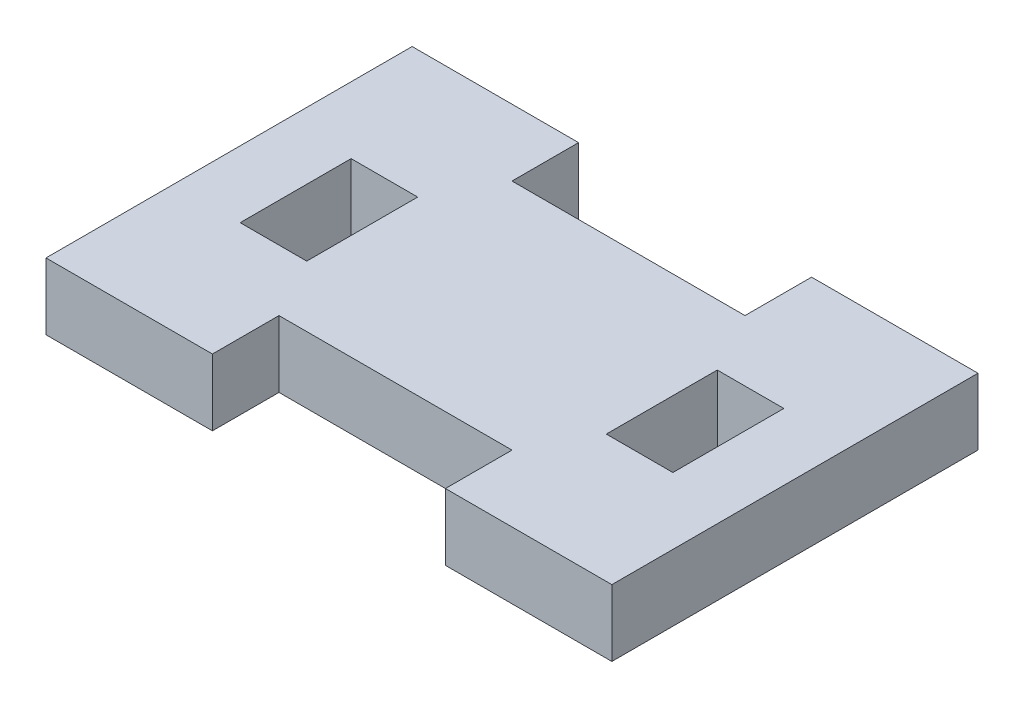
ISO-10303-21;
HEADER;
FILE_DESCRIPTION(('STEP AP214'),'2;1');
FILE_NAME('part.step','',(''),(''),'','','');
FILE_SCHEMA(('AUTOMOTIVE_DESIGN { 1 0 10303 214 1 1 1 1 }'));
ENDSEC;
DATA;
#1=APPLICATION_CONTEXT('core data for automotive mechanical design processes');
#2=APPLICATION_PROTOCOL_DEFINITION('international standard','automotive_design',2000,#1);
#3=PRODUCT_CONTEXT('',#1,'mechanical');
#4=PRODUCT('Part','Part','',(#3));
#5=PRODUCT_RELATED_PRODUCT_CATEGORY('part','',(#4));
#6=PRODUCT_DEFINITION_FORMATION('','',#4);
#7=PRODUCT_DEFINITION_CONTEXT('part definition',#1,'design');
#8=PRODUCT_DEFINITION('design','',#6,#7);
#9=PRODUCT_DEFINITION_SHAPE('','',#8);
#10=(LENGTH_UNIT() NAMED_UNIT(*) SI_UNIT(.MILLI.,.METRE.));
#11=(NAMED_UNIT(*) PLANE_ANGLE_UNIT() SI_UNIT($,.RADIAN.));
#12=(NAMED_UNIT(*) SI_UNIT($,.STERADIAN.) SOLID_ANGLE_UNIT());
#13=UNCERTAINTY_MEASURE_WITH_UNIT(LENGTH_MEASURE(1.E-05),#10,'distance_accuracy_value','');
#14=(GEOMETRIC_REPRESENTATION_CONTEXT(3) GLOBAL_UNCERTAINTY_ASSIGNED_CONTEXT((#13)) GLOBAL_UNIT_ASSIGNED_CONTEXT((#10,
#11,#12)) REPRESENTATION_CONTEXT('',''));
#15=CARTESIAN_POINT('',(0.,0.,0.));
#16=DIRECTION('',(0.,0.,1.));
#17=DIRECTION('',(1.,0.,0.));
#18=AXIS2_PLACEMENT_3D('',#15,#16,#17);
#19=CARTESIAN_POINT('',(0.,3.,5.75));
#20=DIRECTION('',(0.,0.,1.));
#21=DIRECTION('',(1.,0.,0.));
#22=AXIS2_PLACEMENT_3D('',#19,#20,#21);
#23=PLANE('',#22);
#24=DIRECTION('',(-1.,0.,0.));
#25=VECTOR('',#24,1.);
#26=CARTESIAN_POINT('',(0.,0.,5.75));
#27=LINE('',#26,#25);
#28=CARTESIAN_POINT('',(6.,0.,5.75));
#29=VERTEX_POINT('',#28);
#30=CARTESIAN_POINT('',(3.,0.,5.75));
#31=VERTEX_POINT('',#30);
#32=EDGE_CURVE('E342',#29,#31,#27,.T.);
#33=ORIENTED_EDGE('',*,*,#32,.F.);
#34=DIRECTION('',(0.,-1.,0.));
#35=VECTOR('',#34,1.);
#36=CARTESIAN_POINT('',(6.,3.,5.75));
#37=LINE('',#36,#35);
#38=CARTESIAN_POINT('',(6.,3.,5.75));
#39=VERTEX_POINT('',#38);
#40=EDGE_CURVE('E11',#39,#29,#37,.T.);
#41=ORIENTED_EDGE('',*,*,#40,.F.);
#42=DIRECTION('',(-1.,0.,0.));
#43=VECTOR('',#42,1.);
#44=CARTESIAN_POINT('',(0.,3.,5.75));
#45=LINE('',#44,#43);
#46=CARTESIAN_POINT('',(3.,3.,5.75));
#47=VERTEX_POINT('',#46);
#48=EDGE_CURVE('E204',#39,#47,#45,.T.);
#49=ORIENTED_EDGE('',*,*,#48,.T.);
#50=DIRECTION('',(0.,-1.,0.));
#51=VECTOR('',#50,1.);
#52=CARTESIAN_POINT('',(3.,3.,5.75));
#53=LINE('',#52,#51);
#54=EDGE_CURVE('E65',#47,#31,#53,.T.);
#55=ORIENTED_EDGE('',*,*,#54,.T.);
#56=EDGE_LOOP('',(#33,#41,#49,#55));
#57=FACE_BOUND('',#56,.T.);
#58=ADVANCED_FACE('F45',(#57),#23,.T.);
#59=CARTESIAN_POINT('',(6.,3.,0.));
#60=DIRECTION('',(1.,0.,0.));
#61=DIRECTION('',(0.,0.,-1.));
#62=AXIS2_PLACEMENT_3D('',#59,#60,#61);
#63=PLANE('',#62);
#64=DIRECTION('',(0.,0.,1.));
#65=VECTOR('',#64,1.);
#66=CARTESIAN_POINT('',(6.,0.,0.));
#67=LINE('',#66,#65);
#68=CARTESIAN_POINT('',(6.,0.,10.75));
#69=VERTEX_POINT('',#68);
#70=EDGE_CURVE('E210',#29,#69,#67,.T.);
#71=ORIENTED_EDGE('',*,*,#70,.T.);
#72=DIRECTION('',(0.,-1.,0.));
#73=VECTOR('',#72,1.);
#74=CARTESIAN_POINT('',(6.,3.,10.75));
#75=LINE('',#74,#73);
#76=CARTESIAN_POINT('',(6.,3.,10.75));
#77=VERTEX_POINT('',#76);
#78=EDGE_CURVE('E56',#77,#69,#75,.T.);
#79=ORIENTED_EDGE('',*,*,#78,.F.);
#80=DIRECTION('',(0.,0.,1.));
#81=VECTOR('',#80,1.);
#82=CARTESIAN_POINT('',(6.,3.,0.));
#83=LINE('',#82,#81);
#84=EDGE_CURVE('E199',#39,#77,#83,.T.);
#85=ORIENTED_EDGE('',*,*,#84,.F.);
#86=ORIENTED_EDGE('',*,*,#40,.T.);
#87=EDGE_LOOP('',(#71,#79,#85,#86));
#88=FACE_BOUND('',#87,.T.);
#89=ADVANCED_FACE('F208',(#88),#63,.F.);
#90=CARTESIAN_POINT('',(0.,3.,10.75));
#91=DIRECTION('',(0.,0.,1.));
#92=DIRECTION('',(1.,0.,0.));
#93=AXIS2_PLACEMENT_3D('',#90,#91,#92);
#94=PLANE('',#93);
#95=DIRECTION('',(-1.,0.,0.));
#96=VECTOR('',#95,1.);
#97=CARTESIAN_POINT('',(0.,0.,10.75));
#98=LINE('',#97,#96);
#99=CARTESIAN_POINT('',(3.,0.,10.75));
#100=VERTEX_POINT('',#99);
#101=EDGE_CURVE('E347',#69,#100,#98,.T.);
#102=ORIENTED_EDGE('',*,*,#101,.T.);
#103=DIRECTION('',(0.,-1.,0.));
#104=VECTOR('',#103,1.);
#105=CARTESIAN_POINT('',(3.,3.,10.75));
#106=LINE('',#105,#104);
#107=CARTESIAN_POINT('',(3.,3.,10.75));
#108=VERTEX_POINT('',#107);
#109=EDGE_CURVE('E127',#108,#100,#106,.T.);
#110=ORIENTED_EDGE('',*,*,#109,.F.);
#111=DIRECTION('',(-1.,0.,0.));
#112=VECTOR('',#111,1.);
#113=CARTESIAN_POINT('',(0.,3.,10.75));
#114=LINE('',#113,#112);
#115=EDGE_CURVE('E190',#77,#108,#114,.T.);
#116=ORIENTED_EDGE('',*,*,#115,.F.);
#117=ORIENTED_EDGE('',*,*,#78,.T.);
#118=EDGE_LOOP('',(#102,#110,#116,#117));
#119=FACE_BOUND('',#118,.T.);
#120=ADVANCED_FACE('F192',(#119),#94,.F.);
#121=CARTESIAN_POINT('',(19.5,3.,0.));
#122=DIRECTION('',(1.,0.,0.));
#123=DIRECTION('',(0.,0.,-1.));
#124=AXIS2_PLACEMENT_3D('',#121,#122,#123);
#125=PLANE('',#124);
#126=DIRECTION('',(0.,0.,1.));
#127=VECTOR('',#126,1.);
#128=CARTESIAN_POINT('',(19.5,0.,0.));
#129=LINE('',#128,#127);
#130=CARTESIAN_POINT('',(19.5,0.,5.75));
#131=VERTEX_POINT('',#130);
#132=CARTESIAN_POINT('',(19.5,0.,10.75));
#133=VERTEX_POINT('',#132);
#134=EDGE_CURVE('E326',#131,#133,#129,.T.);
#135=ORIENTED_EDGE('',*,*,#134,.F.);
#136=DIRECTION('',(0.,-1.,0.));
#137=VECTOR('',#136,1.);
#138=CARTESIAN_POINT('',(19.5,3.,5.75));
#139=LINE('',#138,#137);
#140=CARTESIAN_POINT('',(19.5,3.,5.75));
#141=VERTEX_POINT('',#140);
#142=EDGE_CURVE('E227',#141,#131,#139,.T.);
#143=ORIENTED_EDGE('',*,*,#142,.F.);
#144=DIRECTION('',(0.,0.,1.));
#145=VECTOR('',#144,1.);
#146=CARTESIAN_POINT('',(19.5,3.,0.));
#147=LINE('',#146,#145);
#148=CARTESIAN_POINT('',(19.5,3.,10.75));
#149=VERTEX_POINT('',#148);
#150=EDGE_CURVE('E395',#141,#149,#147,.T.);
#151=ORIENTED_EDGE('',*,*,#150,.T.);
#152=DIRECTION('',(0.,-1.,0.));
#153=VECTOR('',#152,1.);
#154=CARTESIAN_POINT('',(19.5,3.,10.75));
#155=LINE('',#154,#153);
#156=EDGE_CURVE('E217',#149,#133,#155,.T.);
#157=ORIENTED_EDGE('',*,*,#156,.T.);
#158=EDGE_LOOP('',(#135,#143,#151,#157));
#159=FACE_BOUND('',#158,.T.);
#160=ADVANCED_FACE('F445',(#159),#125,.T.);
#161=CARTESIAN_POINT('',(0.,3.,5.75000000000001));
#162=DIRECTION('',(0.,0.,-1.));
#163=DIRECTION('',(-1.,0.,0.));
#164=AXIS2_PLACEMENT_3D('',#161,#162,#163);
#165=PLANE('',#164);
#166=DIRECTION('',(1.,0.,0.));
#167=VECTOR('',#166,1.);
#168=CARTESIAN_POINT('',(0.,0.,5.75000000000001));
#169=LINE('',#168,#167);
#170=CARTESIAN_POINT('',(22.5,0.,5.75));
#171=VERTEX_POINT('',#170);
#172=EDGE_CURVE('E330',#131,#171,#169,.T.);
#173=ORIENTED_EDGE('',*,*,#172,.T.);
#174=DIRECTION('',(0.,-1.,0.));
#175=VECTOR('',#174,1.);
#176=CARTESIAN_POINT('',(22.5,3.,5.75));
#177=LINE('',#176,#175);
#178=CARTESIAN_POINT('',(22.5,3.,5.75));
#179=VERTEX_POINT('',#178);
#180=EDGE_CURVE('E223',#179,#171,#177,.T.);
#181=ORIENTED_EDGE('',*,*,#180,.F.);
#182=DIRECTION('',(1.,0.,0.));
#183=VECTOR('',#182,1.);
#184=CARTESIAN_POINT('',(0.,3.,5.75000000000001));
#185=LINE('',#184,#183);
#186=EDGE_CURVE('E399',#141,#179,#185,.T.);
#187=ORIENTED_EDGE('',*,*,#186,.F.);
#188=ORIENTED_EDGE('',*,*,#142,.T.);
#189=EDGE_LOOP('',(#173,#181,#187,#188));
#190=FACE_BOUND('',#189,.T.);
#191=ADVANCED_FACE('F441',(#190),#165,.F.);
#192=CARTESIAN_POINT('',(22.5,3.,0.));
#193=DIRECTION('',(1.,0.,0.));
#194=DIRECTION('',(0.,0.,-1.));
#195=AXIS2_PLACEMENT_3D('',#192,#193,#194);
#196=PLANE('',#195);
#197=DIRECTION('',(0.,0.,1.));
#198=VECTOR('',#197,1.);
#199=CARTESIAN_POINT('',(22.5,0.,0.));
#200=LINE('',#199,#198);
#201=CARTESIAN_POINT('',(22.5,0.,10.75));
#202=VERTEX_POINT('',#201);
#203=EDGE_CURVE('E334',#171,#202,#200,.T.);
#204=ORIENTED_EDGE('',*,*,#203,.T.);
#205=DIRECTION('',(0.,-1.,0.));
#206=VECTOR('',#205,1.);
#207=CARTESIAN_POINT('',(22.5,3.,10.75));
#208=LINE('',#207,#206);
#209=CARTESIAN_POINT('',(22.5,3.,10.75));
#210=VERTEX_POINT('',#209);
#211=EDGE_CURVE('E220',#210,#202,#208,.T.);
#212=ORIENTED_EDGE('',*,*,#211,.F.);
#213=DIRECTION('',(0.,0.,1.));
#214=VECTOR('',#213,1.);
#215=CARTESIAN_POINT('',(22.5,3.,0.));
#216=LINE('',#215,#214);
#217=EDGE_CURVE('E403',#179,#210,#216,.T.);
#218=ORIENTED_EDGE('',*,*,#217,.F.);
#219=ORIENTED_EDGE('',*,*,#180,.T.);
#220=EDGE_LOOP('',(#204,#212,#218,#219));
#221=FACE_BOUND('',#220,.T.);
#222=ADVANCED_FACE('F438',(#221),#196,.F.);
#223=CARTESIAN_POINT('',(25.5,3.,0.));
#224=DIRECTION('',(1.,0.,0.));
#225=DIRECTION('',(0.,0.,-1.));
#226=AXIS2_PLACEMENT_3D('',#223,#224,#225);
#227=PLANE('',#226);
#228=DIRECTION('',(0.,0.,1.));
#229=VECTOR('',#228,1.);
#230=CARTESIAN_POINT('',(25.5,0.,0.));
#231=LINE('',#230,#229);
#232=CARTESIAN_POINT('',(25.5,0.,0.));
#233=VERTEX_POINT('',#232);
#234=CARTESIAN_POINT('',(25.5,0.,16.5));
#235=VERTEX_POINT('',#234);
#236=EDGE_CURVE('E278',#233,#235,#231,.T.);
#237=ORIENTED_EDGE('',*,*,#236,.F.);
#238=DIRECTION('',(0.,-1.,0.));
#239=VECTOR('',#238,1.);
#240=CARTESIAN_POINT('',(25.5,3.,0.));
#241=LINE('',#240,#239);
#242=CARTESIAN_POINT('',(25.5,3.,0.));
#243=VERTEX_POINT('',#242);
#244=EDGE_CURVE('E49',#243,#233,#241,.T.);
#245=ORIENTED_EDGE('',*,*,#244,.F.);
#246=DIRECTION('',(0.,0.,1.));
#247=VECTOR('',#246,1.);
#248=CARTESIAN_POINT('',(25.5,3.,0.));
#249=LINE('',#248,#247);
#250=CARTESIAN_POINT('',(25.5,3.,16.5));
#251=VERTEX_POINT('',#250);
#252=EDGE_CURVE('E353',#243,#251,#249,.T.);
#253=ORIENTED_EDGE('',*,*,#252,.T.);
#254=DIRECTION('',(0.,-1.,0.));
#255=VECTOR('',#254,1.);
#256=CARTESIAN_POINT('',(25.5,3.,16.5));
#257=LINE('',#256,#255);
#258=EDGE_CURVE('E230',#251,#235,#257,.T.);
#259=ORIENTED_EDGE('',*,*,#258,.T.);
#260=EDGE_LOOP('',(#237,#245,#253,#259));
#261=FACE_BOUND('',#260,.T.);
#262=ADVANCED_FACE('F47',(#261),#227,.T.);
#263=CARTESIAN_POINT('',(0.,3.,0.));
#264=DIRECTION('',(0.,0.,-1.));
#265=DIRECTION('',(-1.,0.,0.));
#266=AXIS2_PLACEMENT_3D('',#263,#264,#265);
#267=PLANE('',#266);
#268=DIRECTION('',(1.,0.,0.));
#269=VECTOR('',#268,1.);
#270=CARTESIAN_POINT('',(0.,0.,0.));
#271=LINE('',#270,#269);
#272=CARTESIAN_POINT('',(18.,0.,0.));
#273=VERTEX_POINT('',#272);
#274=EDGE_CURVE('E274',#273,#233,#271,.T.);
#275=ORIENTED_EDGE('',*,*,#274,.F.);
#276=DIRECTION('',(0.,-1.,0.));
#277=VECTOR('',#276,1.);
#278=CARTESIAN_POINT('',(18.,3.,0.));
#279=LINE('',#278,#277);
#280=CARTESIAN_POINT('',(18.,3.,0.));
#281=VERTEX_POINT('',#280);
#282=EDGE_CURVE('E262',#281,#273,#279,.T.);
#283=ORIENTED_EDGE('',*,*,#282,.F.);
#284=DIRECTION('',(1.,0.,0.));
#285=VECTOR('',#284,1.);
#286=CARTESIAN_POINT('',(0.,3.,0.));
#287=LINE('',#286,#285);
#288=EDGE_CURVE('E276',#281,#243,#287,.T.);
#289=ORIENTED_EDGE('',*,*,#288,.T.);
#290=ORIENTED_EDGE('',*,*,#244,.T.);
#291=EDGE_LOOP('',(#275,#283,#289,#290));
#292=FACE_BOUND('',#291,.T.);
#293=ADVANCED_FACE('F272',(#292),#267,.T.);
#294=CARTESIAN_POINT('',(18.,3.,0.));
#295=DIRECTION('',(1.,0.,0.));
#296=DIRECTION('',(0.,0.,-1.));
#297=AXIS2_PLACEMENT_3D('',#294,#295,#296);
#298=PLANE('',#297);
#299=DIRECTION('',(0.,0.,1.));
#300=VECTOR('',#299,1.);
#301=CARTESIAN_POINT('',(18.,0.,0.));
#302=LINE('',#301,#300);
#303=CARTESIAN_POINT('',(18.,0.,3.));
#304=VERTEX_POINT('',#303);
#305=EDGE_CURVE('E288',#273,#304,#302,.T.);
#306=ORIENTED_EDGE('',*,*,#305,.T.);
#307=DIRECTION('',(0.,-1.,0.));
#308=VECTOR('',#307,1.);
#309=CARTESIAN_POINT('',(18.,3.,3.));
#310=LINE('',#309,#308);
#311=CARTESIAN_POINT('',(18.,3.,3.));
#312=VERTEX_POINT('',#311);
#313=EDGE_CURVE('E260',#312,#304,#310,.T.);
#314=ORIENTED_EDGE('',*,*,#313,.F.);
#315=DIRECTION('',(0.,0.,1.));
#316=VECTOR('',#315,1.);
#317=CARTESIAN_POINT('',(18.,3.,0.));
#318=LINE('',#317,#316);
#319=EDGE_CURVE('E359',#281,#312,#318,.T.);
#320=ORIENTED_EDGE('',*,*,#319,.F.);
#321=ORIENTED_EDGE('',*,*,#282,.T.);
#322=EDGE_LOOP('',(#306,#314,#320,#321));
#323=FACE_BOUND('',#322,.T.);
#324=ADVANCED_FACE('F480',(#323),#298,.F.);
#325=CARTESIAN_POINT('',(0.,3.,3.));
#326=DIRECTION('',(0.,0.,-1.));
#327=DIRECTION('',(-1.,0.,0.));
#328=AXIS2_PLACEMENT_3D('',#325,#326,#327);
#329=PLANE('',#328);
#330=DIRECTION('',(1.,0.,0.));
#331=VECTOR('',#330,1.);
#332=CARTESIAN_POINT('',(0.,0.,3.));
#333=LINE('',#332,#331);
#334=CARTESIAN_POINT('',(7.5,0.,3.));
#335=VERTEX_POINT('',#334);
#336=EDGE_CURVE('E292',#335,#304,#333,.T.);
#337=ORIENTED_EDGE('',*,*,#336,.F.);
#338=DIRECTION('',(0.,-1.,0.));
#339=VECTOR('',#338,1.);
#340=CARTESIAN_POINT('',(7.5,3.,3.));
#341=LINE('',#340,#339);
#342=CARTESIAN_POINT('',(7.5,3.,3.));
#343=VERTEX_POINT('',#342);
#344=EDGE_CURVE('E257',#343,#335,#341,.T.);
#345=ORIENTED_EDGE('',*,*,#344,.F.);
#346=DIRECTION('',(1.,0.,0.));
#347=VECTOR('',#346,1.);
#348=CARTESIAN_POINT('',(0.,3.,3.));
#349=LINE('',#348,#347);
#350=EDGE_CURVE('E364',#343,#312,#349,.T.);
#351=ORIENTED_EDGE('',*,*,#350,.T.);
#352=ORIENTED_EDGE('',*,*,#313,.T.);
#353=EDGE_LOOP('',(#337,#345,#351,#352));
#354=FACE_BOUND('',#353,.T.);
#355=ADVANCED_FACE('F476',(#354),#329,.T.);
#356=CARTESIAN_POINT('',(7.5,3.,0.));
#357=DIRECTION('',(1.,0.,0.));
#358=DIRECTION('',(0.,0.,-1.));
#359=AXIS2_PLACEMENT_3D('',#356,#357,#358);
#360=PLANE('',#359);
#361=DIRECTION('',(0.,0.,1.));
#362=VECTOR('',#361,1.);
#363=CARTESIAN_POINT('',(7.5,0.,0.));
#364=LINE('',#363,#362);
#365=CARTESIAN_POINT('',(7.5,0.,0.));
#366=VERTEX_POINT('',#365);
#367=EDGE_CURVE('E298',#366,#335,#364,.T.);
#368=ORIENTED_EDGE('',*,*,#367,.F.);
#369=DIRECTION('',(0.,-1.,0.));
#370=VECTOR('',#369,1.);
#371=CARTESIAN_POINT('',(7.5,3.,0.));
#372=LINE('',#371,#370);
#373=CARTESIAN_POINT('',(7.5,3.,0.));
#374=VERTEX_POINT('',#373);
#375=EDGE_CURVE('E254',#374,#366,#372,.T.);
#376=ORIENTED_EDGE('',*,*,#375,.F.);
#377=DIRECTION('',(0.,0.,1.));
#378=VECTOR('',#377,1.);
#379=CARTESIAN_POINT('',(7.5,3.,0.));
#380=LINE('',#379,#378);
#381=EDGE_CURVE('E368',#374,#343,#380,.T.);
#382=ORIENTED_EDGE('',*,*,#381,.T.);
#383=ORIENTED_EDGE('',*,*,#344,.T.);
#384=EDGE_LOOP('',(#368,#376,#382,#383));
#385=FACE_BOUND('',#384,.T.);
#386=ADVANCED_FACE('F472',(#385),#360,.T.);
#387=CARTESIAN_POINT('',(0.,3.,0.));
#388=DIRECTION('',(0.,0.,-1.));
#389=DIRECTION('',(-1.,0.,0.));
#390=AXIS2_PLACEMENT_3D('',#387,#388,#389);
#391=PLANE('',#390);
#392=DIRECTION('',(1.,0.,0.));
#393=VECTOR('',#392,1.);
#394=CARTESIAN_POINT('',(0.,0.,0.));
#395=LINE('',#394,#393);
#396=CARTESIAN_POINT('',(0.,0.,0.));
#397=VERTEX_POINT('',#396);
#398=EDGE_CURVE('E302',#397,#366,#395,.T.);
#399=ORIENTED_EDGE('',*,*,#398,.F.);
#400=DIRECTION('',(0.,-1.,0.));
#401=VECTOR('',#400,1.);
#402=CARTESIAN_POINT('',(0.,3.,0.));
#403=LINE('',#402,#401);
#404=CARTESIAN_POINT('',(0.,3.,0.));
#405=VERTEX_POINT('',#404);
#406=EDGE_CURVE('E251',#405,#397,#403,.T.);
#407=ORIENTED_EDGE('',*,*,#406,.F.);
#408=DIRECTION('',(1.,0.,0.));
#409=VECTOR('',#408,1.);
#410=CARTESIAN_POINT('',(0.,3.,0.));
#411=LINE('',#410,#409);
#412=EDGE_CURVE('E372',#405,#374,#411,.T.);
#413=ORIENTED_EDGE('',*,*,#412,.T.);
#414=ORIENTED_EDGE('',*,*,#375,.T.);
#415=EDGE_LOOP('',(#399,#407,#413,#414));
#416=FACE_BOUND('',#415,.T.);
#417=ADVANCED_FACE('F468',(#416),#391,.T.);
#418=CARTESIAN_POINT('',(0.,3.,0.));
#419=DIRECTION('',(1.,0.,0.));
#420=DIRECTION('',(0.,0.,-1.));
#421=AXIS2_PLACEMENT_3D('',#418,#419,#420);
#422=PLANE('',#421);
#423=DIRECTION('',(0.,0.,1.));
#424=VECTOR('',#423,1.);
#425=CARTESIAN_POINT('',(0.,0.,0.));
#426=LINE('',#425,#424);
#427=CARTESIAN_POINT('',(0.,0.,16.5));
#428=VERTEX_POINT('',#427);
#429=EDGE_CURVE('E306',#397,#428,#426,.T.);
#430=ORIENTED_EDGE('',*,*,#429,.T.);
#431=DIRECTION('',(0.,-1.,0.));
#432=VECTOR('',#431,1.);
#433=CARTESIAN_POINT('',(0.,3.,16.5));
#434=LINE('',#433,#432);
#435=CARTESIAN_POINT('',(0.,3.,16.5));
#436=VERTEX_POINT('',#435);
#437=EDGE_CURVE('E247',#436,#428,#434,.T.);
#438=ORIENTED_EDGE('',*,*,#437,.F.);
#439=DIRECTION('',(0.,0.,1.));
#440=VECTOR('',#439,1.);
#441=CARTESIAN_POINT('',(0.,3.,0.));
#442=LINE('',#441,#440);
#443=EDGE_CURVE('E376',#405,#436,#442,.T.);
#444=ORIENTED_EDGE('',*,*,#443,.F.);
#445=ORIENTED_EDGE('',*,*,#406,.T.);
#446=EDGE_LOOP('',(#430,#438,#444,#445));
#447=FACE_BOUND('',#446,.T.);
#448=ADVANCED_FACE('F464',(#447),#422,.F.);
#449=CARTESIAN_POINT('',(0.,3.,16.5));
#450=DIRECTION('',(0.,0.,-1.));
#451=DIRECTION('',(-1.,0.,0.));
#452=AXIS2_PLACEMENT_3D('',#449,#450,#451);
#453=PLANE('',#452);
#454=DIRECTION('',(1.,0.,0.));
#455=VECTOR('',#454,1.);
#456=CARTESIAN_POINT('',(0.,0.,16.5));
#457=LINE('',#456,#455);
#458=CARTESIAN_POINT('',(7.5,0.,16.5));
#459=VERTEX_POINT('',#458);
#460=EDGE_CURVE('E309',#428,#459,#457,.T.);
#461=ORIENTED_EDGE('',*,*,#460,.T.);
#462=DIRECTION('',(0.,-1.,0.));
#463=VECTOR('',#462,1.);
#464=CARTESIAN_POINT('',(7.5,3.,16.5));
#465=LINE('',#464,#463);
#466=CARTESIAN_POINT('',(7.5,3.,16.5));
#467=VERTEX_POINT('',#466);
#468=EDGE_CURVE('E243',#467,#459,#465,.T.);
#469=ORIENTED_EDGE('',*,*,#468,.F.);
#470=DIRECTION('',(1.,0.,0.));
#471=VECTOR('',#470,1.);
#472=CARTESIAN_POINT('',(0.,3.,16.5));
#473=LINE('',#472,#471);
#474=EDGE_CURVE('E379',#436,#467,#473,.T.);
#475=ORIENTED_EDGE('',*,*,#474,.F.);
#476=ORIENTED_EDGE('',*,*,#437,.T.);
#477=EDGE_LOOP('',(#461,#469,#475,#476));
#478=FACE_BOUND('',#477,.T.);
#479=ADVANCED_FACE('F460',(#478),#453,.F.);
#480=CARTESIAN_POINT('',(7.5,3.,0.));
#481=DIRECTION('',(-1.,0.,0.));
#482=DIRECTION('',(0.,0.,1.));
#483=AXIS2_PLACEMENT_3D('',#480,#481,#482);
#484=PLANE('',#483);
#485=DIRECTION('',(0.,0.,-1.));
#486=VECTOR('',#485,1.);
#487=CARTESIAN_POINT('',(7.5,0.,0.));
#488=LINE('',#487,#486);
#489=CARTESIAN_POINT('',(7.5,0.,13.5));
#490=VERTEX_POINT('',#489);
#491=EDGE_CURVE('E312',#459,#490,#488,.T.);
#492=ORIENTED_EDGE('',*,*,#491,.T.);
#493=DIRECTION('',(0.,-1.,0.));
#494=VECTOR('',#493,1.);
#495=CARTESIAN_POINT('',(7.5,3.,13.5));
#496=LINE('',#495,#494);
#497=CARTESIAN_POINT('',(7.5,3.,13.5));
#498=VERTEX_POINT('',#497);
#499=EDGE_CURVE('E239',#498,#490,#496,.T.);
#500=ORIENTED_EDGE('',*,*,#499,.F.);
#501=DIRECTION('',(0.,0.,-1.));
#502=VECTOR('',#501,1.);
#503=CARTESIAN_POINT('',(7.5,3.,0.));
#504=LINE('',#503,#502);
#505=EDGE_CURVE('E382',#467,#498,#504,.T.);
#506=ORIENTED_EDGE('',*,*,#505,.F.);
#507=ORIENTED_EDGE('',*,*,#468,.T.);
#508=EDGE_LOOP('',(#492,#500,#506,#507));
#509=FACE_BOUND('',#508,.T.);
#510=ADVANCED_FACE('F456',(#509),#484,.F.);
#511=CARTESIAN_POINT('',(0.,3.,13.5));
#512=DIRECTION('',(0.,0.,-1.));
#513=DIRECTION('',(-1.,0.,0.));
#514=AXIS2_PLACEMENT_3D('',#511,#512,#513);
#515=PLANE('',#514);
#516=DIRECTION('',(1.,0.,0.));
#517=VECTOR('',#516,1.);
#518=CARTESIAN_POINT('',(0.,0.,13.5));
#519=LINE('',#518,#517);
#520=CARTESIAN_POINT('',(18.,0.,13.5));
#521=VERTEX_POINT('',#520);
#522=EDGE_CURVE('E315',#490,#521,#519,.T.);
#523=ORIENTED_EDGE('',*,*,#522,.T.);
#524=DIRECTION('',(0.,-1.,0.));
#525=VECTOR('',#524,1.);
#526=CARTESIAN_POINT('',(18.,3.,13.5));
#527=LINE('',#526,#525);
#528=CARTESIAN_POINT('',(18.,3.,13.5));
#529=VERTEX_POINT('',#528);
#530=EDGE_CURVE('E236',#529,#521,#527,.T.);
#531=ORIENTED_EDGE('',*,*,#530,.F.);
#532=DIRECTION('',(1.,0.,0.));
#533=VECTOR('',#532,1.);
#534=CARTESIAN_POINT('',(0.,3.,13.5));
#535=LINE('',#534,#533);
#536=EDGE_CURVE('E385',#498,#529,#535,.T.);
#537=ORIENTED_EDGE('',*,*,#536,.F.);
#538=ORIENTED_EDGE('',*,*,#499,.T.);
#539=EDGE_LOOP('',(#523,#531,#537,#538));
#540=FACE_BOUND('',#539,.T.);
#541=ADVANCED_FACE('F452',(#540),#515,.F.);
#542=CARTESIAN_POINT('',(18.,3.,0.));
#543=DIRECTION('',(-1.,0.,0.));
#544=DIRECTION('',(0.,0.,1.));
#545=AXIS2_PLACEMENT_3D('',#542,#543,#544);
#546=PLANE('',#545);
#547=DIRECTION('',(0.,0.,-1.));
#548=VECTOR('',#547,1.);
#549=CARTESIAN_POINT('',(18.,0.,0.));
#550=LINE('',#549,#548);
#551=CARTESIAN_POINT('',(18.,0.,16.5));
#552=VERTEX_POINT('',#551);
#553=EDGE_CURVE('E319',#552,#521,#550,.T.);
#554=ORIENTED_EDGE('',*,*,#553,.F.);
#555=DIRECTION('',(0.,-1.,0.));
#556=VECTOR('',#555,1.);
#557=CARTESIAN_POINT('',(18.,3.,16.5));
#558=LINE('',#557,#556);
#559=CARTESIAN_POINT('',(18.,3.,16.5));
#560=VERTEX_POINT('',#559);
#561=EDGE_CURVE('E233',#560,#552,#558,.T.);
#562=ORIENTED_EDGE('',*,*,#561,.F.);
#563=DIRECTION('',(0.,0.,-1.));
#564=VECTOR('',#563,1.);
#565=CARTESIAN_POINT('',(18.,3.,0.));
#566=LINE('',#565,#564);
#567=EDGE_CURVE('E388',#560,#529,#566,.T.);
#568=ORIENTED_EDGE('',*,*,#567,.T.);
#569=ORIENTED_EDGE('',*,*,#530,.T.);
#570=EDGE_LOOP('',(#554,#562,#568,#569));
#571=FACE_BOUND('',#570,.T.);
#572=ADVANCED_FACE('F436',(#571),#546,.T.);
#573=CARTESIAN_POINT('',(0.,3.,10.75));
#574=DIRECTION('',(0.,0.,-1.));
#575=DIRECTION('',(-1.,0.,0.));
#576=AXIS2_PLACEMENT_3D('',#573,#574,#575);
#577=PLANE('',#576);
#578=DIRECTION('',(1.,0.,0.));
#579=VECTOR('',#578,1.);
#580=CARTESIAN_POINT('',(0.,0.,10.75));
#581=LINE('',#580,#579);
#582=EDGE_CURVE('E338',#133,#202,#581,.T.);
#583=ORIENTED_EDGE('',*,*,#582,.F.);
#584=ORIENTED_EDGE('',*,*,#156,.F.);
#585=DIRECTION('',(1.,0.,0.));
#586=VECTOR('',#585,1.);
#587=CARTESIAN_POINT('',(0.,3.,10.75));
#588=LINE('',#587,#586);
#589=EDGE_CURVE('E406',#149,#210,#588,.T.);
#590=ORIENTED_EDGE('',*,*,#589,.T.);
#591=ORIENTED_EDGE('',*,*,#211,.T.);
#592=EDGE_LOOP('',(#583,#584,#590,#591));
#593=FACE_BOUND('',#592,.T.);
#594=ADVANCED_FACE('F422',(#593),#577,.T.);
#595=CARTESIAN_POINT('',(0.,3.,16.5));
#596=DIRECTION('',(0.,0.,-1.));
#597=DIRECTION('',(-1.,0.,0.));
#598=AXIS2_PLACEMENT_3D('',#595,#596,#597);
#599=PLANE('',#598);
#600=DIRECTION('',(1.,0.,0.));
#601=VECTOR('',#600,1.);
#602=CARTESIAN_POINT('',(0.,0.,16.5));
#603=LINE('',#602,#601);
#604=EDGE_CURVE('E323',#552,#235,#603,.T.);
#605=ORIENTED_EDGE('',*,*,#604,.T.);
#606=ORIENTED_EDGE('',*,*,#258,.F.);
#607=DIRECTION('',(1.,0.,0.));
#608=VECTOR('',#607,1.);
#609=CARTESIAN_POINT('',(0.,3.,16.5));
#610=LINE('',#609,#608);
#611=EDGE_CURVE('E392',#560,#251,#610,.T.);
#612=ORIENTED_EDGE('',*,*,#611,.F.);
#613=ORIENTED_EDGE('',*,*,#561,.T.);
#614=EDGE_LOOP('',(#605,#606,#612,#613));
#615=FACE_BOUND('',#614,.T.);
#616=ADVANCED_FACE('F414',(#615),#599,.F.);
#617=CARTESIAN_POINT('',(3.,3.,0.));
#618=DIRECTION('',(1.,0.,0.));
#619=DIRECTION('',(0.,0.,-1.));
#620=AXIS2_PLACEMENT_3D('',#617,#618,#619);
#621=PLANE('',#620);
#622=DIRECTION('',(0.,0.,1.));
#623=VECTOR('',#622,1.);
#624=CARTESIAN_POINT('',(3.,0.,0.));
#625=LINE('',#624,#623);
#626=EDGE_CURVE('E350',#31,#100,#625,.T.);
#627=ORIENTED_EDGE('',*,*,#626,.F.);
#628=ORIENTED_EDGE('',*,*,#54,.F.);
#629=DIRECTION('',(0.,0.,1.));
#630=VECTOR('',#629,1.);
#631=CARTESIAN_POINT('',(3.,3.,0.));
#632=LINE('',#631,#630);
#633=EDGE_CURVE('E198',#47,#108,#632,.T.);
#634=ORIENTED_EDGE('',*,*,#633,.T.);
#635=ORIENTED_EDGE('',*,*,#109,.T.);
#636=EDGE_LOOP('',(#627,#628,#634,#635));
#637=FACE_BOUND('',#636,.T.);
#638=ADVANCED_FACE('F412',(#637),#621,.T.);
#639=CARTESIAN_POINT('',(0.,3.,0.));
#640=DIRECTION('',(0.,1.,0.));
#641=DIRECTION('',(0.,0.,1.));
#642=AXIS2_PLACEMENT_3D('',#639,#640,#641);
#643=PLANE('',#642);
#644=ORIENTED_EDGE('',*,*,#252,.F.);
#645=ORIENTED_EDGE('',*,*,#288,.F.);
#646=ORIENTED_EDGE('',*,*,#319,.T.);
#647=ORIENTED_EDGE('',*,*,#350,.F.);
#648=ORIENTED_EDGE('',*,*,#381,.F.);
#649=ORIENTED_EDGE('',*,*,#412,.F.);
#650=ORIENTED_EDGE('',*,*,#443,.T.);
#651=ORIENTED_EDGE('',*,*,#474,.T.);
#652=ORIENTED_EDGE('',*,*,#505,.T.);
#653=ORIENTED_EDGE('',*,*,#536,.T.);
#654=ORIENTED_EDGE('',*,*,#567,.F.);
#655=ORIENTED_EDGE('',*,*,#611,.T.);
#656=EDGE_LOOP('',(#644,#645,#646,#647,#648,#649,#650,#651,#652,#653,#654,#655));
#657=FACE_BOUND('',#656,.T.);
#658=ORIENTED_EDGE('',*,*,#150,.F.);
#659=ORIENTED_EDGE('',*,*,#186,.T.);
#660=ORIENTED_EDGE('',*,*,#217,.T.);
#661=ORIENTED_EDGE('',*,*,#589,.F.);
#662=EDGE_LOOP('',(#658,#659,#660,#661));
#663=FACE_BOUND('',#662,.T.);
#664=ORIENTED_EDGE('',*,*,#48,.F.);
#665=ORIENTED_EDGE('',*,*,#84,.T.);
#666=ORIENTED_EDGE('',*,*,#115,.T.);
#667=ORIENTED_EDGE('',*,*,#633,.F.);
#668=EDGE_LOOP('',(#664,#665,#666,#667));
#669=FACE_BOUND('',#668,.T.);
#670=ADVANCED_FACE('F203',(#657,#663,#669),#643,.T.);
#671=CARTESIAN_POINT('',(0.,0.,0.));
#672=DIRECTION('',(0.,1.,0.));
#673=DIRECTION('',(0.,0.,1.));
#674=AXIS2_PLACEMENT_3D('',#671,#672,#673);
#675=PLANE('',#674);
#676=ORIENTED_EDGE('',*,*,#236,.T.);
#677=ORIENTED_EDGE('',*,*,#604,.F.);
#678=ORIENTED_EDGE('',*,*,#553,.T.);
#679=ORIENTED_EDGE('',*,*,#522,.F.);
#680=ORIENTED_EDGE('',*,*,#491,.F.);
#681=ORIENTED_EDGE('',*,*,#460,.F.);
#682=ORIENTED_EDGE('',*,*,#429,.F.);
#683=ORIENTED_EDGE('',*,*,#398,.T.);
#684=ORIENTED_EDGE('',*,*,#367,.T.);
#685=ORIENTED_EDGE('',*,*,#336,.T.);
#686=ORIENTED_EDGE('',*,*,#305,.F.);
#687=ORIENTED_EDGE('',*,*,#274,.T.);
#688=EDGE_LOOP('',(#676,#677,#678,#679,#680,#681,#682,#683,#684,#685,#686,#687));
#689=FACE_BOUND('',#688,.T.);
#690=ORIENTED_EDGE('',*,*,#134,.T.);
#691=ORIENTED_EDGE('',*,*,#582,.T.);
#692=ORIENTED_EDGE('',*,*,#203,.F.);
#693=ORIENTED_EDGE('',*,*,#172,.F.);
#694=EDGE_LOOP('',(#690,#691,#692,#693));
#695=FACE_BOUND('',#694,.T.);
#696=ORIENTED_EDGE('',*,*,#32,.T.);
#697=ORIENTED_EDGE('',*,*,#626,.T.);
#698=ORIENTED_EDGE('',*,*,#101,.F.);
#699=ORIENTED_EDGE('',*,*,#70,.F.);
#700=EDGE_LOOP('',(#696,#697,#698,#699));
#701=FACE_BOUND('',#700,.T.);
#702=ADVANCED_FACE('F285',(#689,#695,#701),#675,.F.);
#703=CLOSED_SHELL('',(#58,#89,#120,#160,#191,#222,#262,#293,#324,#355,#386,#417,#448,#479,#510,
#541,#572,#594,#616,#638,#670,#702));
#704=MANIFOLD_SOLID_BREP('B2',#703);
#705=ADVANCED_BREP_SHAPE_REPRESENTATION('',(#18,#704),#14);
#706=SHAPE_DEFINITION_REPRESENTATION(#9,#705);
ENDSEC;
END-ISO-10303-21;
